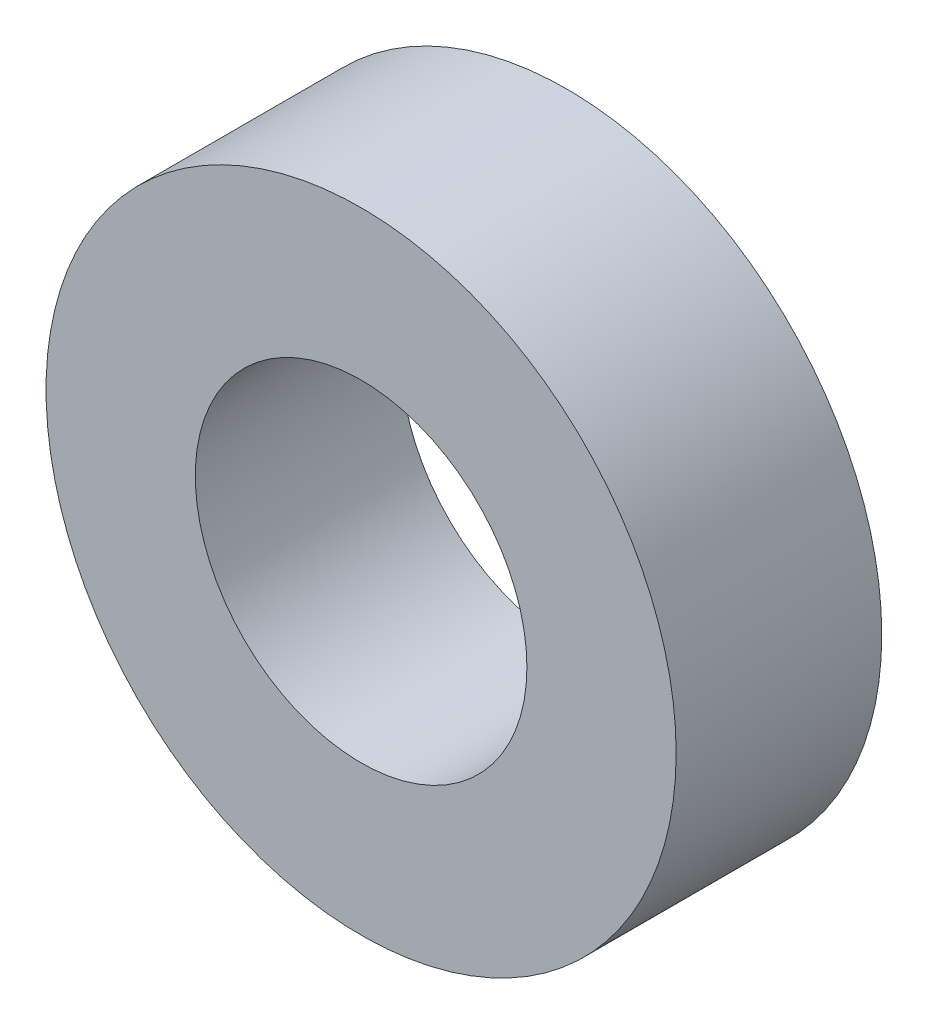
ISO-10303-21;
HEADER;
FILE_DESCRIPTION(('STEP AP214'),'2;1');
FILE_NAME('part.step','',(''),(''),'','','');
FILE_SCHEMA(('AUTOMOTIVE_DESIGN { 1 0 10303 214 1 1 1 1 }'));
ENDSEC;
DATA;
#1=APPLICATION_CONTEXT('core data for automotive mechanical design processes');
#2=APPLICATION_PROTOCOL_DEFINITION('international standard','automotive_design',2000,#1);
#3=PRODUCT_CONTEXT('',#1,'mechanical');
#4=PRODUCT('Part','Part','',(#3));
#5=PRODUCT_RELATED_PRODUCT_CATEGORY('part','',(#4));
#6=PRODUCT_DEFINITION_FORMATION('','',#4);
#7=PRODUCT_DEFINITION_CONTEXT('part definition',#1,'design');
#8=PRODUCT_DEFINITION('design','',#6,#7);
#9=PRODUCT_DEFINITION_SHAPE('','',#8);
#10=(LENGTH_UNIT() NAMED_UNIT(*) SI_UNIT(.MILLI.,.METRE.));
#11=(NAMED_UNIT(*) PLANE_ANGLE_UNIT() SI_UNIT($,.RADIAN.));
#12=(NAMED_UNIT(*) SI_UNIT($,.STERADIAN.) SOLID_ANGLE_UNIT());
#13=UNCERTAINTY_MEASURE_WITH_UNIT(LENGTH_MEASURE(1.E-05),#10,'distance_accuracy_value','');
#14=(GEOMETRIC_REPRESENTATION_CONTEXT(3) GLOBAL_UNCERTAINTY_ASSIGNED_CONTEXT((#13)) GLOBAL_UNIT_ASSIGNED_CONTEXT((#10,
#11,#12)) REPRESENTATION_CONTEXT('',''));
#15=CARTESIAN_POINT('',(0.,0.,0.));
#16=DIRECTION('',(0.,0.,1.));
#17=DIRECTION('',(1.,0.,0.));
#18=AXIS2_PLACEMENT_3D('',#15,#16,#17);
#19=CARTESIAN_POINT('',(0.,0.,-3.1));
#20=DIRECTION('',(0.,0.,1.));
#21=DIRECTION('',(1.,0.,0.));
#22=AXIS2_PLACEMENT_3D('',#19,#20,#21);
#23=CYLINDRICAL_SURFACE('',#22,4.75);
#24=CARTESIAN_POINT('',(0.,0.,-3.1));
#25=DIRECTION('',(0.,0.,1.));
#26=DIRECTION('',(1.,0.,0.));
#27=AXIS2_PLACEMENT_3D('',#24,#25,#26);
#28=CIRCLE('',#27,4.75);
#29=CARTESIAN_POINT('',(4.75,0.,-3.1));
#30=VERTEX_POINT('',#29);
#31=EDGE_CURVE('E10',#30,#30,#28,.T.);
#32=CARTESIAN_POINT('',(0.,0.,0.));
#33=DIRECTION('',(0.,0.,1.));
#34=DIRECTION('',(1.,0.,0.));
#35=AXIS2_PLACEMENT_3D('',#32,#33,#34);
#36=CIRCLE('',#35,4.75);
#37=CARTESIAN_POINT('',(4.75,0.,0.));
#38=VERTEX_POINT('',#37);
#39=EDGE_CURVE('E32',#38,#38,#36,.T.);
#40=CARTESIAN_POINT('',(4.75,0.,-3.1));
#41=CARTESIAN_POINT('',(4.75,0.,-3.06770833333333));
#42=CARTESIAN_POINT('',(4.75,0.,-3.03541666666667));
#43=CARTESIAN_POINT('',(4.75,0.,-2.97083333333333));
#44=CARTESIAN_POINT('',(4.75,0.,-2.93854166666667));
#45=CARTESIAN_POINT('',(4.75,0.,-2.87395833333333));
#46=CARTESIAN_POINT('',(4.75,0.,-2.84166666666667));
#47=CARTESIAN_POINT('',(4.75,0.,-2.77708333333333));
#48=CARTESIAN_POINT('',(4.75,0.,-2.74479166666667));
#49=CARTESIAN_POINT('',(4.75,0.,-2.68020833333333));
#50=CARTESIAN_POINT('',(4.75,0.,-2.64791666666667));
#51=CARTESIAN_POINT('',(4.75,0.,-2.58333333333333));
#52=CARTESIAN_POINT('',(4.75,0.,-2.55104166666667));
#53=CARTESIAN_POINT('',(4.75,0.,-2.48645833333333));
#54=CARTESIAN_POINT('',(4.75,0.,-2.45416666666667));
#55=CARTESIAN_POINT('',(4.75,0.,-2.38958333333333));
#56=CARTESIAN_POINT('',(4.75,0.,-2.35729166666667));
#57=CARTESIAN_POINT('',(4.75,0.,-2.29270833333333));
#58=CARTESIAN_POINT('',(4.75,0.,-2.26041666666667));
#59=CARTESIAN_POINT('',(4.75,0.,-2.19583333333333));
#60=CARTESIAN_POINT('',(4.75,0.,-2.16354166666667));
#61=CARTESIAN_POINT('',(4.75,0.,-2.09895833333333));
#62=CARTESIAN_POINT('',(4.75,0.,-2.06666666666667));
#63=CARTESIAN_POINT('',(4.75,0.,-2.00208333333333));
#64=CARTESIAN_POINT('',(4.75,0.,-1.96979166666667));
#65=CARTESIAN_POINT('',(4.75,0.,-1.90520833333333));
#66=CARTESIAN_POINT('',(4.75,0.,-1.87291666666667));
#67=CARTESIAN_POINT('',(4.75,0.,-1.80833333333333));
#68=CARTESIAN_POINT('',(4.75,0.,-1.77604166666667));
#69=CARTESIAN_POINT('',(4.75,0.,-1.71145833333333));
#70=CARTESIAN_POINT('',(4.75,0.,-1.67916666666667));
#71=CARTESIAN_POINT('',(4.75,0.,-1.61458333333333));
#72=CARTESIAN_POINT('',(4.75,0.,-1.58229166666667));
#73=CARTESIAN_POINT('',(4.75,0.,-1.51770833333333));
#74=CARTESIAN_POINT('',(4.75,0.,-1.48541666666667));
#75=CARTESIAN_POINT('',(4.75,0.,-1.42083333333333));
#76=CARTESIAN_POINT('',(4.75,0.,-1.38854166666667));
#77=CARTESIAN_POINT('',(4.75,0.,-1.32395833333333));
#78=CARTESIAN_POINT('',(4.75,0.,-1.29166666666667));
#79=CARTESIAN_POINT('',(4.75,0.,-1.22708333333333));
#80=CARTESIAN_POINT('',(4.75,0.,-1.19479166666667));
#81=CARTESIAN_POINT('',(4.75,0.,-1.13020833333333));
#82=CARTESIAN_POINT('',(4.75,0.,-1.09791666666667));
#83=CARTESIAN_POINT('',(4.75,0.,-1.03333333333333));
#84=CARTESIAN_POINT('',(4.75,0.,-1.00104166666667));
#85=CARTESIAN_POINT('',(4.75,0.,-0.936458333333334));
#86=CARTESIAN_POINT('',(4.75,0.,-0.904166666666667));
#87=CARTESIAN_POINT('',(4.75,0.,-0.839583333333334));
#88=CARTESIAN_POINT('',(4.75,0.,-0.807291666666667));
#89=CARTESIAN_POINT('',(4.75,0.,-0.742708333333334));
#90=CARTESIAN_POINT('',(4.75,0.,-0.710416666666667));
#91=CARTESIAN_POINT('',(4.75,0.,-0.645833333333334));
#92=CARTESIAN_POINT('',(4.75,0.,-0.613541666666667));
#93=CARTESIAN_POINT('',(4.75,0.,-0.548958333333333));
#94=CARTESIAN_POINT('',(4.75,0.,-0.516666666666667));
#95=CARTESIAN_POINT('',(4.75,0.,-0.452083333333333));
#96=CARTESIAN_POINT('',(4.75,0.,-0.419791666666667));
#97=CARTESIAN_POINT('',(4.75,0.,-0.355208333333334));
#98=CARTESIAN_POINT('',(4.75,0.,-0.322916666666667));
#99=CARTESIAN_POINT('',(4.75,0.,-0.258333333333333));
#100=CARTESIAN_POINT('',(4.75,0.,-0.226041666666667));
#101=CARTESIAN_POINT('',(4.75,0.,-0.161458333333333));
#102=CARTESIAN_POINT('',(4.75,0.,-0.129166666666667));
#103=CARTESIAN_POINT('',(4.75,0.,-0.0645833333333335));
#104=CARTESIAN_POINT('',(4.75,0.,-0.0322916666666667));
#105=CARTESIAN_POINT('',(4.75,0.,0.));
#106=B_SPLINE_CURVE_WITH_KNOTS('',3,(#40,#41,#42,#43,#44,#45,#46,#47,#48,#49,#50,#51,#52,#53,
#54,#55,#56,#57,#58,#59,#60,#61,#62,#63,#64,#65,#66,#67,#68,#69,#70,#71,#72,#73,#74,#75,#76,#77,
#78,#79,#80,#81,#82,#83,#84,#85,#86,#87,#88,#89,#90,#91,#92,#93,#94,#95,#96,#97,#98,#99,#100,
#101,#102,#103,#104,#105),.UNSPECIFIED.,.F.,.F.,(4,2,2,2,2,2,2,2,2,2,2,2,2,2,2,2,2,2,2,2,2,2,2,
2,2,2,2,2,2,2,2,2,4),(0.,0.0968750000000002,0.19375,0.290625,0.3875,0.484375,0.58125,0.678125,
0.775,0.871875,0.96875,1.065625,1.1625,1.259375,1.35625,1.453125,1.55,1.646875,1.74375,1.840625,
1.9375,2.034375,2.13125,2.228125,2.325,2.421875,2.51875,2.615625,2.7125,2.809375,2.90625,
3.003125,3.1),.UNSPECIFIED.);
#107=EDGE_CURVE('BSEAM29',#30,#38,#106,.T.);
#108=ORIENTED_EDGE('',*,*,#31,.T.);
#109=ORIENTED_EDGE('',*,*,#39,.F.);
#110=ORIENTED_EDGE('',*,*,#107,.T.);
#111=ORIENTED_EDGE('',*,*,#107,.F.);
#112=EDGE_LOOP('',(#108,#110,#109,#111));
#113=FACE_BOUND('',#112,.T.);
#114=ADVANCED_FACE('F29',(#113),#23,.T.);
#115=CARTESIAN_POINT('',(0.,0.,-3.1));
#116=DIRECTION('',(0.,0.,1.));
#117=DIRECTION('',(1.,0.,0.));
#118=AXIS2_PLACEMENT_3D('',#115,#116,#117);
#119=PLANE('',#118);
#120=CARTESIAN_POINT('',(0.,0.,-3.1));
#121=DIRECTION('',(0.,0.,1.));
#122=DIRECTION('',(1.,0.,0.));
#123=AXIS2_PLACEMENT_3D('',#120,#121,#122);
#124=CIRCLE('',#123,2.5);
#125=CARTESIAN_POINT('',(2.5,0.,-3.1));
#126=VERTEX_POINT('',#125);
#127=EDGE_CURVE('E39',#126,#126,#124,.T.);
#128=ORIENTED_EDGE('',*,*,#127,.T.);
#129=EDGE_LOOP('',(#128));
#130=FACE_BOUND('',#129,.T.);
#131=ORIENTED_EDGE('',*,*,#31,.F.);
#132=EDGE_LOOP('',(#131));
#133=FACE_BOUND('',#132,.T.);
#134=ADVANCED_FACE('F47',(#130,#133),#119,.F.);
#135=CARTESIAN_POINT('',(0.,0.,0.));
#136=DIRECTION('',(0.,0.,1.));
#137=DIRECTION('',(1.,0.,0.));
#138=AXIS2_PLACEMENT_3D('',#135,#136,#137);
#139=PLANE('',#138);
#140=CARTESIAN_POINT('',(0.,0.,0.));
#141=DIRECTION('',(0.,0.,1.));
#142=DIRECTION('',(1.,0.,0.));
#143=AXIS2_PLACEMENT_3D('',#140,#141,#142);
#144=CIRCLE('',#143,2.5);
#145=CARTESIAN_POINT('',(2.5,0.,0.));
#146=VERTEX_POINT('',#145);
#147=EDGE_CURVE('E41',#146,#146,#144,.T.);
#148=ORIENTED_EDGE('',*,*,#147,.F.);
#149=EDGE_LOOP('',(#148));
#150=FACE_BOUND('',#149,.T.);
#151=ORIENTED_EDGE('',*,*,#39,.T.);
#152=EDGE_LOOP('',(#151));
#153=FACE_BOUND('',#152,.T.);
#154=ADVANCED_FACE('F53',(#150,#153),#139,.T.);
#155=CARTESIAN_POINT('',(0.,0.,-3.1));
#156=DIRECTION('',(0.,0.,1.));
#157=DIRECTION('',(1.,0.,0.));
#158=AXIS2_PLACEMENT_3D('',#155,#156,#157);
#159=CYLINDRICAL_SURFACE('',#158,2.5);
#160=CARTESIAN_POINT('',(2.5,0.,-3.1));
#161=CARTESIAN_POINT('',(2.5,0.,-3.06770833333333));
#162=CARTESIAN_POINT('',(2.5,0.,-3.03541666666667));
#163=CARTESIAN_POINT('',(2.5,0.,-2.97083333333333));
#164=CARTESIAN_POINT('',(2.5,0.,-2.93854166666667));
#165=CARTESIAN_POINT('',(2.5,0.,-2.87395833333333));
#166=CARTESIAN_POINT('',(2.5,0.,-2.84166666666667));
#167=CARTESIAN_POINT('',(2.5,0.,-2.77708333333333));
#168=CARTESIAN_POINT('',(2.5,0.,-2.74479166666667));
#169=CARTESIAN_POINT('',(2.5,0.,-2.68020833333333));
#170=CARTESIAN_POINT('',(2.5,0.,-2.64791666666667));
#171=CARTESIAN_POINT('',(2.5,0.,-2.58333333333333));
#172=CARTESIAN_POINT('',(2.5,0.,-2.55104166666667));
#173=CARTESIAN_POINT('',(2.5,0.,-2.48645833333333));
#174=CARTESIAN_POINT('',(2.5,0.,-2.45416666666667));
#175=CARTESIAN_POINT('',(2.5,0.,-2.38958333333333));
#176=CARTESIAN_POINT('',(2.5,0.,-2.35729166666667));
#177=CARTESIAN_POINT('',(2.5,0.,-2.29270833333333));
#178=CARTESIAN_POINT('',(2.5,0.,-2.26041666666667));
#179=CARTESIAN_POINT('',(2.5,0.,-2.19583333333333));
#180=CARTESIAN_POINT('',(2.5,0.,-2.16354166666667));
#181=CARTESIAN_POINT('',(2.5,0.,-2.09895833333333));
#182=CARTESIAN_POINT('',(2.5,0.,-2.06666666666667));
#183=CARTESIAN_POINT('',(2.5,0.,-2.00208333333333));
#184=CARTESIAN_POINT('',(2.5,0.,-1.96979166666667));
#185=CARTESIAN_POINT('',(2.5,0.,-1.90520833333333));
#186=CARTESIAN_POINT('',(2.5,0.,-1.87291666666667));
#187=CARTESIAN_POINT('',(2.5,0.,-1.80833333333333));
#188=CARTESIAN_POINT('',(2.5,0.,-1.77604166666667));
#189=CARTESIAN_POINT('',(2.5,0.,-1.71145833333333));
#190=CARTESIAN_POINT('',(2.5,0.,-1.67916666666667));
#191=CARTESIAN_POINT('',(2.5,0.,-1.61458333333333));
#192=CARTESIAN_POINT('',(2.5,0.,-1.58229166666667));
#193=CARTESIAN_POINT('',(2.5,0.,-1.51770833333333));
#194=CARTESIAN_POINT('',(2.5,0.,-1.48541666666667));
#195=CARTESIAN_POINT('',(2.5,0.,-1.42083333333333));
#196=CARTESIAN_POINT('',(2.5,0.,-1.38854166666667));
#197=CARTESIAN_POINT('',(2.5,0.,-1.32395833333333));
#198=CARTESIAN_POINT('',(2.5,0.,-1.29166666666667));
#199=CARTESIAN_POINT('',(2.5,0.,-1.22708333333333));
#200=CARTESIAN_POINT('',(2.5,0.,-1.19479166666667));
#201=CARTESIAN_POINT('',(2.5,0.,-1.13020833333333));
#202=CARTESIAN_POINT('',(2.5,0.,-1.09791666666667));
#203=CARTESIAN_POINT('',(2.5,0.,-1.03333333333333));
#204=CARTESIAN_POINT('',(2.5,0.,-1.00104166666667));
#205=CARTESIAN_POINT('',(2.5,0.,-0.936458333333334));
#206=CARTESIAN_POINT('',(2.5,0.,-0.904166666666667));
#207=CARTESIAN_POINT('',(2.5,0.,-0.839583333333334));
#208=CARTESIAN_POINT('',(2.5,0.,-0.807291666666667));
#209=CARTESIAN_POINT('',(2.5,0.,-0.742708333333334));
#210=CARTESIAN_POINT('',(2.5,0.,-0.710416666666667));
#211=CARTESIAN_POINT('',(2.5,0.,-0.645833333333334));
#212=CARTESIAN_POINT('',(2.5,0.,-0.613541666666667));
#213=CARTESIAN_POINT('',(2.5,0.,-0.548958333333333));
#214=CARTESIAN_POINT('',(2.5,0.,-0.516666666666667));
#215=CARTESIAN_POINT('',(2.5,0.,-0.452083333333333));
#216=CARTESIAN_POINT('',(2.5,0.,-0.419791666666667));
#217=CARTESIAN_POINT('',(2.5,0.,-0.355208333333334));
#218=CARTESIAN_POINT('',(2.5,0.,-0.322916666666667));
#219=CARTESIAN_POINT('',(2.5,0.,-0.258333333333333));
#220=CARTESIAN_POINT('',(2.5,0.,-0.226041666666667));
#221=CARTESIAN_POINT('',(2.5,0.,-0.161458333333333));
#222=CARTESIAN_POINT('',(2.5,0.,-0.129166666666667));
#223=CARTESIAN_POINT('',(2.5,0.,-0.0645833333333335));
#224=CARTESIAN_POINT('',(2.5,0.,-0.0322916666666667));
#225=CARTESIAN_POINT('',(2.5,0.,0.));
#226=B_SPLINE_CURVE_WITH_KNOTS('',3,(#160,#161,#162,#163,#164,#165,#166,#167,#168,#169,#170,
#171,#172,#173,#174,#175,#176,#177,#178,#179,#180,#181,#182,#183,#184,#185,#186,#187,#188,#189,
#190,#191,#192,#193,#194,#195,#196,#197,#198,#199,#200,#201,#202,#203,#204,#205,#206,#207,#208,
#209,#210,#211,#212,#213,#214,#215,#216,#217,#218,#219,#220,#221,#222,#223,#224,#225),
.UNSPECIFIED.,.F.,.F.,(4,2,2,2,2,2,2,2,2,2,2,2,2,2,2,2,2,2,2,2,2,2,2,2,2,2,2,2,2,2,2,2,4),(0.,
0.0968750000000002,0.19375,0.290625,0.3875,0.484375,0.58125,0.678125,0.775,0.871875,0.96875,
1.065625,1.1625,1.259375,1.35625,1.453125,1.55,1.646875,1.74375,1.840625,1.9375,2.034375,
2.13125,2.228125,2.325,2.421875,2.51875,2.615625,2.7125,2.809375,2.90625,3.003125,3.1),.UNSPECIFIED.);
#227=EDGE_CURVE('BSEAM50',#126,#146,#226,.T.);
#228=ORIENTED_EDGE('',*,*,#127,.F.);
#229=ORIENTED_EDGE('',*,*,#147,.T.);
#230=ORIENTED_EDGE('',*,*,#227,.T.);
#231=ORIENTED_EDGE('',*,*,#227,.F.);
#232=EDGE_LOOP('',(#228,#230,#229,#231));
#233=FACE_BOUND('',#232,.T.);
#234=ADVANCED_FACE('F50',(#233),#159,.F.);
#235=CLOSED_SHELL('',(#114,#134,#154,#234));
#236=MANIFOLD_SOLID_BREP('B2',#235);
#237=ADVANCED_BREP_SHAPE_REPRESENTATION('',(#18,#236),#14);
#238=SHAPE_DEFINITION_REPRESENTATION(#9,#237);
ENDSEC;
END-ISO-10303-21;
